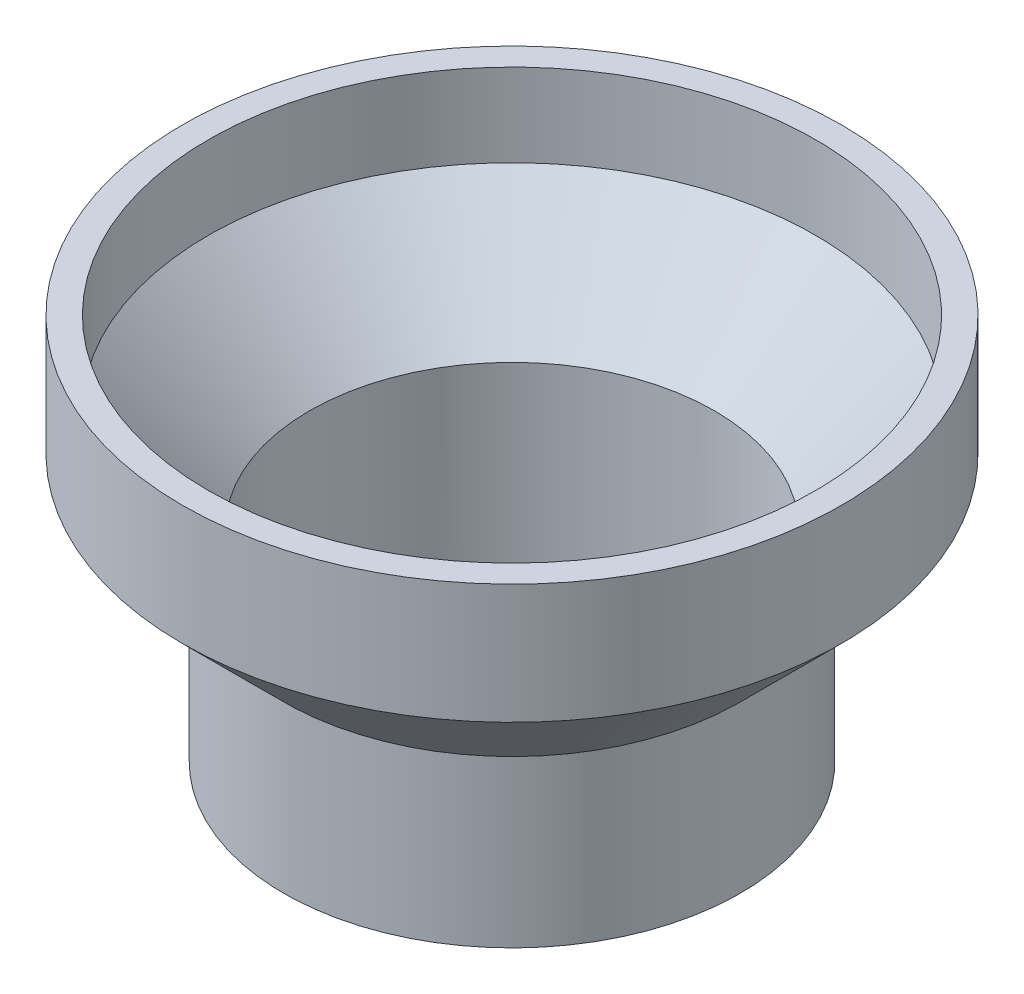
ISO-10303-21;
HEADER;
FILE_DESCRIPTION(('STEP AP214'),'2;1');
FILE_NAME('part.step','',(''),(''),'','','');
FILE_SCHEMA(('AUTOMOTIVE_DESIGN { 1 0 10303 214 1 1 1 1 }'));
ENDSEC;
DATA;
#1=APPLICATION_CONTEXT('core data for automotive mechanical design processes');
#2=APPLICATION_PROTOCOL_DEFINITION('international standard','automotive_design',2000,#1);
#3=PRODUCT_CONTEXT('',#1,'mechanical');
#4=PRODUCT('Part','Part','',(#3));
#5=PRODUCT_RELATED_PRODUCT_CATEGORY('part','',(#4));
#6=PRODUCT_DEFINITION_FORMATION('','',#4);
#7=PRODUCT_DEFINITION_CONTEXT('part definition',#1,'design');
#8=PRODUCT_DEFINITION('design','',#6,#7);
#9=PRODUCT_DEFINITION_SHAPE('','',#8);
#10=(LENGTH_UNIT() NAMED_UNIT(*) SI_UNIT(.MILLI.,.METRE.));
#11=(NAMED_UNIT(*) PLANE_ANGLE_UNIT() SI_UNIT($,.RADIAN.));
#12=(NAMED_UNIT(*) SI_UNIT($,.STERADIAN.) SOLID_ANGLE_UNIT());
#13=UNCERTAINTY_MEASURE_WITH_UNIT(LENGTH_MEASURE(1.E-05),#10,'distance_accuracy_value','');
#14=(GEOMETRIC_REPRESENTATION_CONTEXT(3) GLOBAL_UNCERTAINTY_ASSIGNED_CONTEXT((#13)) GLOBAL_UNIT_ASSIGNED_CONTEXT((#10,
#11,#12)) REPRESENTATION_CONTEXT('',''));
#15=CARTESIAN_POINT('',(0.,0.,0.));
#16=DIRECTION('',(0.,0.,1.));
#17=DIRECTION('',(1.,0.,0.));
#18=AXIS2_PLACEMENT_3D('',#15,#16,#17);
#19=CARTESIAN_POINT('',(0.,19.05,0.));
#20=DIRECTION('',(0.,-1.,0.));
#21=DIRECTION('',(0.,0.,-1.));
#22=AXIS2_PLACEMENT_3D('',#19,#20,#21);
#23=CYLINDRICAL_SURFACE('',#22,13.97);
#24=CARTESIAN_POINT('',(0.,13.9699999999999,0.));
#25=DIRECTION('',(0.,1.,0.));
#26=DIRECTION('',(0.,0.,1.));
#27=AXIS2_PLACEMENT_3D('',#24,#25,#26);
#28=CIRCLE('',#27,13.97);
#29=CARTESIAN_POINT('',(0.,13.9699999999999,-13.97));
#30=VERTEX_POINT('',#29);
#31=EDGE_CURVE('E45',#30,#30,#28,.T.);
#32=CARTESIAN_POINT('',(0.,0.,0.));
#33=DIRECTION('',(0.,1.,0.));
#34=DIRECTION('',(0.,0.,1.));
#35=AXIS2_PLACEMENT_3D('',#32,#33,#34);
#36=CIRCLE('',#35,13.97);
#37=CARTESIAN_POINT('',(0.,0.,-13.97));
#38=VERTEX_POINT('',#37);
#39=EDGE_CURVE('E65',#38,#38,#36,.T.);
#40=CARTESIAN_POINT('',(0.,13.9699999999999,-13.97));
#41=CARTESIAN_POINT('',(0.,13.8244791666665,-13.97));
#42=CARTESIAN_POINT('',(0.,13.6789583333332,-13.97));
#43=CARTESIAN_POINT('',(0.,13.3879166666665,-13.97));
#44=CARTESIAN_POINT('',(0.,13.2423958333332,-13.97));
#45=CARTESIAN_POINT('',(0.,12.9513541666665,-13.97));
#46=CARTESIAN_POINT('',(0.,12.8058333333332,-13.97));
#47=CARTESIAN_POINT('',(0.,12.5147916666665,-13.97));
#48=CARTESIAN_POINT('',(0.,12.3692708333332,-13.97));
#49=CARTESIAN_POINT('',(0.,12.0782291666666,-13.97));
#50=CARTESIAN_POINT('',(0.,11.9327083333332,-13.97));
#51=CARTESIAN_POINT('',(0.,11.6416666666666,-13.97));
#52=CARTESIAN_POINT('',(0.,11.4961458333332,-13.97));
#53=CARTESIAN_POINT('',(0.,11.2051041666666,-13.97));
#54=CARTESIAN_POINT('',(0.,11.0595833333332,-13.97));
#55=CARTESIAN_POINT('',(0.,10.7685416666666,-13.97));
#56=CARTESIAN_POINT('',(0.,10.6230208333332,-13.97));
#57=CARTESIAN_POINT('',(0.,10.3319791666666,-13.97));
#58=CARTESIAN_POINT('',(0.,10.1864583333332,-13.97));
#59=CARTESIAN_POINT('',(0.,9.89541666666657,-13.97));
#60=CARTESIAN_POINT('',(0.,9.74989583333324,-13.97));
#61=CARTESIAN_POINT('',(0.,9.45885416666658,-13.97));
#62=CARTESIAN_POINT('',(0.,9.31333333333325,-13.97));
#63=CARTESIAN_POINT('',(0.,9.02229166666658,-13.97));
#64=CARTESIAN_POINT('',(0.,8.87677083333325,-13.97));
#65=CARTESIAN_POINT('',(0.,8.58572916666659,-13.97));
#66=CARTESIAN_POINT('',(0.,8.44020833333325,-13.97));
#67=CARTESIAN_POINT('',(0.,8.14916666666659,-13.97));
#68=CARTESIAN_POINT('',(0.,8.00364583333326,-13.97));
#69=CARTESIAN_POINT('',(0.,7.71260416666659,-13.97));
#70=CARTESIAN_POINT('',(0.,7.56708333333326,-13.97));
#71=CARTESIAN_POINT('',(0.,7.2760416666666,-13.97));
#72=CARTESIAN_POINT('',(0.,7.13052083333327,-13.97));
#73=CARTESIAN_POINT('',(0.,6.8394791666666,-13.97));
#74=CARTESIAN_POINT('',(0.,6.69395833333327,-13.97));
#75=CARTESIAN_POINT('',(0.,6.4029166666666,-13.97));
#76=CARTESIAN_POINT('',(0.,6.25739583333327,-13.97));
#77=CARTESIAN_POINT('',(0.,5.96635416666661,-13.97));
#78=CARTESIAN_POINT('',(0.,5.82083333333328,-13.97));
#79=CARTESIAN_POINT('',(0.,5.52979166666661,-13.97));
#80=CARTESIAN_POINT('',(0.,5.38427083333328,-13.97));
#81=CARTESIAN_POINT('',(0.,5.09322916666662,-13.97));
#82=CARTESIAN_POINT('',(0.,4.94770833333329,-13.97));
#83=CARTESIAN_POINT('',(0.,4.65666666666662,-13.97));
#84=CARTESIAN_POINT('',(0.,4.51114583333329,-13.97));
#85=CARTESIAN_POINT('',(0.,4.22010416666663,-13.97));
#86=CARTESIAN_POINT('',(0.,4.07458333333329,-13.97));
#87=CARTESIAN_POINT('',(0.,3.78354166666663,-13.97));
#88=CARTESIAN_POINT('',(0.,3.6380208333333,-13.97));
#89=CARTESIAN_POINT('',(0.,3.34697916666664,-13.97));
#90=CARTESIAN_POINT('',(0.,3.2014583333333,-13.97));
#91=CARTESIAN_POINT('',(0.,2.91041666666664,-13.97));
#92=CARTESIAN_POINT('',(0.,2.76489583333331,-13.97));
#93=CARTESIAN_POINT('',(0.,2.47385416666664,-13.97));
#94=CARTESIAN_POINT('',(0.,2.32833333333331,-13.97));
#95=CARTESIAN_POINT('',(0.,2.03729166666665,-13.97));
#96=CARTESIAN_POINT('',(0.,1.89177083333332,-13.97));
#97=CARTESIAN_POINT('',(0.,1.60072916666665,-13.97));
#98=CARTESIAN_POINT('',(0.,1.45520833333332,-13.97));
#99=CARTESIAN_POINT('',(0.,1.16416666666666,-13.97));
#100=CARTESIAN_POINT('',(0.,1.01864583333332,-13.97));
#101=CARTESIAN_POINT('',(0.,0.727604166666659,-13.97));
#102=CARTESIAN_POINT('',(0.,0.582083333333327,-13.97));
#103=CARTESIAN_POINT('',(0.,0.291041666666663,-13.97));
#104=CARTESIAN_POINT('',(0.,0.145520833333331,-13.97));
#105=CARTESIAN_POINT('',(0.,0.,-13.97));
#106=B_SPLINE_CURVE_WITH_KNOTS('',3,(#40,#41,#42,#43,#44,#45,#46,#47,#48,#49,#50,#51,#52,#53,
#54,#55,#56,#57,#58,#59,#60,#61,#62,#63,#64,#65,#66,#67,#68,#69,#70,#71,#72,#73,#74,#75,#76,#77,
#78,#79,#80,#81,#82,#83,#84,#85,#86,#87,#88,#89,#90,#91,#92,#93,#94,#95,#96,#97,#98,#99,#100,
#101,#102,#103,#104,#105),.UNSPECIFIED.,.F.,.F.,(4,2,2,2,2,2,2,2,2,2,2,2,2,2,2,2,2,2,2,2,2,2,2,
2,2,2,2,2,2,2,2,2,4),(0.,0.436562499999998,0.873124999999992,1.30968749999999,1.74624999999998,
2.18281249999998,2.61937499999998,3.05593749999997,3.49249999999997,3.92906249999996,
4.36562499999996,4.80218749999996,5.23874999999995,5.67531249999995,6.11187499999994,
6.54843749999994,6.98499999999993,7.42156249999993,7.85812499999993,8.29468749999992,
8.73124999999992,9.16781249999991,9.60437499999991,10.0409374999999,10.4774999999999,
10.9140624999999,11.3506249999999,11.7871874999999,12.2237499999999,12.6603124999999,
13.0968749999999,13.5334374999999,13.9699999999999),.UNSPECIFIED.);
#107=EDGE_CURVE('BSEAM37',#30,#38,#106,.T.);
#108=ORIENTED_EDGE('',*,*,#31,.T.);
#109=ORIENTED_EDGE('',*,*,#39,.F.);
#110=ORIENTED_EDGE('',*,*,#107,.T.);
#111=ORIENTED_EDGE('',*,*,#107,.F.);
#112=EDGE_LOOP('',(#108,#110,#109,#111));
#113=FACE_BOUND('',#112,.T.);
#114=ADVANCED_FACE('F37',(#113),#23,.F.);
#115=CARTESIAN_POINT('',(0.,0.,0.));
#116=DIRECTION('',(0.,1.,0.));
#117=DIRECTION('',(0.,0.,1.));
#118=AXIS2_PLACEMENT_3D('',#115,#116,#117);
#119=PLANE('',#118);
#120=CARTESIAN_POINT('',(0.,0.,0.));
#121=DIRECTION('',(0.,1.,0.));
#122=DIRECTION('',(0.,0.,1.));
#123=AXIS2_PLACEMENT_3D('',#120,#121,#122);
#124=CIRCLE('',#123,15.748);
#125=CARTESIAN_POINT('',(0.,0.,-15.748));
#126=VERTEX_POINT('',#125);
#127=EDGE_CURVE('E61',#126,#126,#124,.T.);
#128=ORIENTED_EDGE('',*,*,#127,.F.);
#129=EDGE_LOOP('',(#128));
#130=FACE_BOUND('',#129,.T.);
#131=ORIENTED_EDGE('',*,*,#39,.T.);
#132=EDGE_LOOP('',(#131));
#133=FACE_BOUND('',#132,.T.);
#134=ADVANCED_FACE('F98',(#130,#133),#119,.F.);
#135=CARTESIAN_POINT('',(0.,19.05,0.));
#136=DIRECTION('',(0.,-1.,0.));
#137=DIRECTION('',(0.,0.,-1.));
#138=AXIS2_PLACEMENT_3D('',#135,#136,#137);
#139=CYLINDRICAL_SURFACE('',#138,15.748);
#140=CARTESIAN_POINT('',(0.,11.4299999999999,0.));
#141=DIRECTION('',(0.,1.,0.));
#142=DIRECTION('',(0.,0.,1.));
#143=AXIS2_PLACEMENT_3D('',#140,#141,#142);
#144=CIRCLE('',#143,15.748);
#145=CARTESIAN_POINT('',(0.,11.4299999999999,-15.748));
#146=VERTEX_POINT('',#145);
#147=EDGE_CURVE('E55',#146,#146,#144,.F.);
#148=CARTESIAN_POINT('',(0.,11.4299999999999,-15.748));
#149=CARTESIAN_POINT('',(0.,11.3109374999999,-15.748));
#150=CARTESIAN_POINT('',(0.,11.1918749999999,-15.748));
#151=CARTESIAN_POINT('',(0.,10.9537499999999,-15.748));
#152=CARTESIAN_POINT('',(0.,10.8346874999999,-15.748));
#153=CARTESIAN_POINT('',(0.,10.5965625,-15.748));
#154=CARTESIAN_POINT('',(0.,10.4775,-15.748));
#155=CARTESIAN_POINT('',(0.,10.239375,-15.748));
#156=CARTESIAN_POINT('',(0.,10.1203125,-15.748));
#157=CARTESIAN_POINT('',(0.,9.88218749999995,-15.748));
#158=CARTESIAN_POINT('',(0.,9.76312499999995,-15.748));
#159=CARTESIAN_POINT('',(0.,9.52499999999996,-15.748));
#160=CARTESIAN_POINT('',(0.,9.40593749999996,-15.748));
#161=CARTESIAN_POINT('',(0.,9.16781249999996,-15.748));
#162=CARTESIAN_POINT('',(0.,9.04874999999996,-15.748));
#163=CARTESIAN_POINT('',(0.,8.81062499999996,-15.748));
#164=CARTESIAN_POINT('',(0.,8.69156249999996,-15.748));
#165=CARTESIAN_POINT('',(0.,8.45343749999996,-15.748));
#166=CARTESIAN_POINT('',(0.,8.33437499999996,-15.748));
#167=CARTESIAN_POINT('',(0.,8.09624999999996,-15.748));
#168=CARTESIAN_POINT('',(0.,7.97718749999996,-15.748));
#169=CARTESIAN_POINT('',(0.,7.73906249999996,-15.748));
#170=CARTESIAN_POINT('',(0.,7.61999999999997,-15.748));
#171=CARTESIAN_POINT('',(0.,7.38187499999997,-15.748));
#172=CARTESIAN_POINT('',(0.,7.26281249999997,-15.748));
#173=CARTESIAN_POINT('',(0.,7.02468749999997,-15.748));
#174=CARTESIAN_POINT('',(0.,6.90562499999997,-15.748));
#175=CARTESIAN_POINT('',(0.,6.66749999999997,-15.748));
#176=CARTESIAN_POINT('',(0.,6.54843749999997,-15.748));
#177=CARTESIAN_POINT('',(0.,6.31031249999997,-15.748));
#178=CARTESIAN_POINT('',(0.,6.19124999999997,-15.748));
#179=CARTESIAN_POINT('',(0.,5.95312499999997,-15.748));
#180=CARTESIAN_POINT('',(0.,5.83406249999997,-15.748));
#181=CARTESIAN_POINT('',(0.,5.59593749999997,-15.748));
#182=CARTESIAN_POINT('',(0.,5.47687499999997,-15.748));
#183=CARTESIAN_POINT('',(0.,5.23874999999997,-15.748));
#184=CARTESIAN_POINT('',(0.,5.11968749999997,-15.748));
#185=CARTESIAN_POINT('',(0.,4.88156249999998,-15.748));
#186=CARTESIAN_POINT('',(0.,4.76249999999998,-15.748));
#187=CARTESIAN_POINT('',(0.,4.52437499999998,-15.748));
#188=CARTESIAN_POINT('',(0.,4.40531249999998,-15.748));
#189=CARTESIAN_POINT('',(0.,4.16718749999998,-15.748));
#190=CARTESIAN_POINT('',(0.,4.04812499999998,-15.748));
#191=CARTESIAN_POINT('',(0.,3.80999999999998,-15.748));
#192=CARTESIAN_POINT('',(0.,3.69093749999998,-15.748));
#193=CARTESIAN_POINT('',(0.,3.45281249999998,-15.748));
#194=CARTESIAN_POINT('',(0.,3.33374999999999,-15.748));
#195=CARTESIAN_POINT('',(0.,3.09562499999999,-15.748));
#196=CARTESIAN_POINT('',(0.,2.97656249999999,-15.748));
#197=CARTESIAN_POINT('',(0.,2.73843749999999,-15.748));
#198=CARTESIAN_POINT('',(0.,2.61937499999999,-15.748));
#199=CARTESIAN_POINT('',(0.,2.38124999999999,-15.748));
#200=CARTESIAN_POINT('',(0.,2.26218749999999,-15.748));
#201=CARTESIAN_POINT('',(0.,2.02406249999999,-15.748));
#202=CARTESIAN_POINT('',(0.,1.90499999999999,-15.748));
#203=CARTESIAN_POINT('',(0.,1.66687499999999,-15.748));
#204=CARTESIAN_POINT('',(0.,1.54781249999999,-15.748));
#205=CARTESIAN_POINT('',(0.,1.30968749999999,-15.748));
#206=CARTESIAN_POINT('',(0.,1.19062499999999,-15.748));
#207=CARTESIAN_POINT('',(0.,0.952499999999995,-15.748));
#208=CARTESIAN_POINT('',(0.,0.833437499999996,-15.748));
#209=CARTESIAN_POINT('',(0.,0.595312499999997,-15.748));
#210=CARTESIAN_POINT('',(0.,0.476249999999998,-15.748));
#211=CARTESIAN_POINT('',(0.,0.238124999999999,-15.748));
#212=CARTESIAN_POINT('',(0.,0.119062499999999,-15.748));
#213=CARTESIAN_POINT('',(0.,0.,-15.748));
#214=B_SPLINE_CURVE_WITH_KNOTS('',3,(#148,#149,#150,#151,#152,#153,#154,#155,#156,#157,#158,
#159,#160,#161,#162,#163,#164,#165,#166,#167,#168,#169,#170,#171,#172,#173,#174,#175,#176,#177,
#178,#179,#180,#181,#182,#183,#184,#185,#186,#187,#188,#189,#190,#191,#192,#193,#194,#195,#196,
#197,#198,#199,#200,#201,#202,#203,#204,#205,#206,#207,#208,#209,#210,#211,#212,#213),
.UNSPECIFIED.,.F.,.F.,(4,2,2,2,2,2,2,2,2,2,2,2,2,2,2,2,2,2,2,2,2,2,2,2,2,2,2,2,2,2,2,2,4),(0.,
0.357187499999998,0.714374999999996,1.0715625,1.42874999999999,1.78593749999999,
2.14312499999999,2.50031249999999,2.85749999999999,3.21468749999999,3.57187499999998,
3.92906249999998,4.28624999999998,4.64343749999998,5.00062499999998,5.35781249999998,
5.71499999999997,6.07218749999997,6.42937499999997,6.78656249999997,7.14374999999997,
7.50093749999997,7.85812499999996,8.21531249999996,8.57249999999996,8.92968749999996,
9.28687499999996,9.64406249999995,10.00125,10.3584375,10.715625,11.0728124999999,
11.4299999999999),.UNSPECIFIED.);
#215=EDGE_CURVE('BSEAM84',#146,#126,#214,.T.);
#216=ORIENTED_EDGE('',*,*,#147,.T.);
#217=ORIENTED_EDGE('',*,*,#127,.T.);
#218=ORIENTED_EDGE('',*,*,#215,.T.);
#219=ORIENTED_EDGE('',*,*,#215,.F.);
#220=EDGE_LOOP('',(#216,#218,#217,#219));
#221=FACE_BOUND('',#220,.T.);
#222=ADVANCED_FACE('F84',(#221),#139,.T.);
#223=CARTESIAN_POINT('',(0.,26.67,0.));
#224=DIRECTION('',(0.,1.,0.));
#225=DIRECTION('',(0.,0.,1.));
#226=AXIS2_PLACEMENT_3D('',#223,#224,#225);
#227=PLANE('',#226);
#228=CARTESIAN_POINT('',(0.,26.67,0.));
#229=DIRECTION('',(0.,1.,0.));
#230=DIRECTION('',(0.,0.,1.));
#231=AXIS2_PLACEMENT_3D('',#228,#229,#230);
#232=CIRCLE('',#231,20.955);
#233=CARTESIAN_POINT('',(0.,26.67,20.955));
#234=VERTEX_POINT('',#233);
#235=EDGE_CURVE('E73',#234,#234,#232,.T.);
#236=ORIENTED_EDGE('',*,*,#235,.F.);
#237=EDGE_LOOP('',(#236));
#238=FACE_BOUND('',#237,.T.);
#239=CARTESIAN_POINT('',(0.,26.67,0.));
#240=DIRECTION('',(0.,1.,0.));
#241=DIRECTION('',(0.,0.,1.));
#242=AXIS2_PLACEMENT_3D('',#239,#240,#241);
#243=CIRCLE('',#242,22.733);
#244=CARTESIAN_POINT('',(0.,26.67,-22.733));
#245=VERTEX_POINT('',#244);
#246=EDGE_CURVE('E69',#245,#245,#243,.T.);
#247=ORIENTED_EDGE('',*,*,#246,.T.);
#248=EDGE_LOOP('',(#247));
#249=FACE_BOUND('',#248,.T.);
#250=ADVANCED_FACE('F80',(#238,#249),#227,.T.);
#251=CARTESIAN_POINT('',(0.,26.67,0.));
#252=DIRECTION('',(0.,-1.,0.));
#253=DIRECTION('',(0.,0.,-1.));
#254=AXIS2_PLACEMENT_3D('',#251,#252,#253);
#255=CYLINDRICAL_SURFACE('',#254,22.733);
#256=CARTESIAN_POINT('',(0.,18.4149999999999,0.));
#257=DIRECTION('',(0.,1.,0.));
#258=DIRECTION('',(0.,0.,1.));
#259=AXIS2_PLACEMENT_3D('',#256,#257,#258);
#260=CIRCLE('',#259,22.733);
#261=CARTESIAN_POINT('',(0.,18.4149999999999,-22.733));
#262=VERTEX_POINT('',#261);
#263=EDGE_CURVE('E50',#262,#262,#260,.T.);
#264=CARTESIAN_POINT('',(0.,18.4149999999999,-22.733));
#265=CARTESIAN_POINT('',(0.,18.5009895833332,-22.733));
#266=CARTESIAN_POINT('',(0.,18.5869791666666,-22.733));
#267=CARTESIAN_POINT('',(0.,18.7589583333332,-22.733));
#268=CARTESIAN_POINT('',(0.,18.8449479166666,-22.733));
#269=CARTESIAN_POINT('',(0.,19.0169270833332,-22.733));
#270=CARTESIAN_POINT('',(0.,19.1029166666666,-22.733));
#271=CARTESIAN_POINT('',(0.,19.2748958333332,-22.733));
#272=CARTESIAN_POINT('',(0.,19.3608854166666,-22.733));
#273=CARTESIAN_POINT('',(0.,19.5328645833332,-22.733));
#274=CARTESIAN_POINT('',(0.,19.6188541666666,-22.733));
#275=CARTESIAN_POINT('',(0.,19.7908333333332,-22.733));
#276=CARTESIAN_POINT('',(0.,19.8768229166666,-22.733));
#277=CARTESIAN_POINT('',(0.,20.0488020833332,-22.733));
#278=CARTESIAN_POINT('',(0.,20.1347916666666,-22.733));
#279=CARTESIAN_POINT('',(0.,20.3067708333332,-22.733));
#280=CARTESIAN_POINT('',(0.,20.3927604166666,-22.733));
#281=CARTESIAN_POINT('',(0.,20.5647395833332,-22.733));
#282=CARTESIAN_POINT('',(0.,20.6507291666666,-22.733));
#283=CARTESIAN_POINT('',(0.,20.8227083333332,-22.733));
#284=CARTESIAN_POINT('',(0.,20.9086979166666,-22.733));
#285=CARTESIAN_POINT('',(0.,21.0806770833333,-22.733));
#286=CARTESIAN_POINT('',(0.,21.1666666666666,-22.733));
#287=CARTESIAN_POINT('',(0.,21.3386458333333,-22.733));
#288=CARTESIAN_POINT('',(0.,21.4246354166666,-22.733));
#289=CARTESIAN_POINT('',(0.,21.5966145833333,-22.733));
#290=CARTESIAN_POINT('',(0.,21.6826041666666,-22.733));
#291=CARTESIAN_POINT('',(0.,21.8545833333333,-22.733));
#292=CARTESIAN_POINT('',(0.,21.9405729166666,-22.733));
#293=CARTESIAN_POINT('',(0.,22.1125520833333,-22.733));
#294=CARTESIAN_POINT('',(0.,22.1985416666666,-22.733));
#295=CARTESIAN_POINT('',(0.,22.3705208333333,-22.733));
#296=CARTESIAN_POINT('',(0.,22.4565104166666,-22.733));
#297=CARTESIAN_POINT('',(0.,22.6284895833333,-22.733));
#298=CARTESIAN_POINT('',(0.,22.7144791666666,-22.733));
#299=CARTESIAN_POINT('',(0.,22.8864583333333,-22.733));
#300=CARTESIAN_POINT('',(0.,22.9724479166666,-22.733));
#301=CARTESIAN_POINT('',(0.,23.1444270833333,-22.733));
#302=CARTESIAN_POINT('',(0.,23.2304166666666,-22.733));
#303=CARTESIAN_POINT('',(0.,23.4023958333333,-22.733));
#304=CARTESIAN_POINT('',(0.,23.4883854166666,-22.733));
#305=CARTESIAN_POINT('',(0.,23.6603645833333,-22.733));
#306=CARTESIAN_POINT('',(0.,23.7463541666666,-22.733));
#307=CARTESIAN_POINT('',(0.,23.9183333333333,-22.733));
#308=CARTESIAN_POINT('',(0.,24.0043229166666,-22.733));
#309=CARTESIAN_POINT('',(0.,24.1763020833333,-22.733));
#310=CARTESIAN_POINT('',(0.,24.2622916666666,-22.733));
#311=CARTESIAN_POINT('',(0.,24.4342708333333,-22.733));
#312=CARTESIAN_POINT('',(0.,24.5202604166666,-22.733));
#313=CARTESIAN_POINT('',(0.,24.6922395833333,-22.733));
#314=CARTESIAN_POINT('',(0.,24.7782291666666,-22.733));
#315=CARTESIAN_POINT('',(0.,24.9502083333333,-22.733));
#316=CARTESIAN_POINT('',(0.,25.0361979166666,-22.733));
#317=CARTESIAN_POINT('',(0.,25.2081770833333,-22.733));
#318=CARTESIAN_POINT('',(0.,25.2941666666666,-22.733));
#319=CARTESIAN_POINT('',(0.,25.4661458333333,-22.733));
#320=CARTESIAN_POINT('',(0.,25.5521354166666,-22.733));
#321=CARTESIAN_POINT('',(0.,25.7241145833333,-22.733));
#322=CARTESIAN_POINT('',(0.,25.8101041666667,-22.733));
#323=CARTESIAN_POINT('',(0.,25.9820833333333,-22.733));
#324=CARTESIAN_POINT('',(0.,26.0680729166667,-22.733));
#325=CARTESIAN_POINT('',(0.,26.2400520833333,-22.733));
#326=CARTESIAN_POINT('',(0.,26.3260416666667,-22.733));
#327=CARTESIAN_POINT('',(0.,26.4980208333333,-22.733));
#328=CARTESIAN_POINT('',(0.,26.5840104166667,-22.733));
#329=CARTESIAN_POINT('',(0.,26.67,-22.733));
#330=B_SPLINE_CURVE_WITH_KNOTS('',3,(#264,#265,#266,#267,#268,#269,#270,#271,#272,#273,#274,
#275,#276,#277,#278,#279,#280,#281,#282,#283,#284,#285,#286,#287,#288,#289,#290,#291,#292,#293,
#294,#295,#296,#297,#298,#299,#300,#301,#302,#303,#304,#305,#306,#307,#308,#309,#310,#311,#312,
#313,#314,#315,#316,#317,#318,#319,#320,#321,#322,#323,#324,#325,#326,#327,#328,#329),
.UNSPECIFIED.,.F.,.F.,(4,2,2,2,2,2,2,2,2,2,2,2,2,2,2,2,2,2,2,2,2,2,2,2,2,2,2,2,2,2,2,2,4),(0.,
0.257968750000004,0.515937500000004,0.773906250000008,1.03187500000001,1.28984375000002,
1.54781250000002,1.80578125000002,2.06375000000003,2.32171875000003,2.57968750000003,
2.83765625000004,3.09562500000004,3.35359375000005,3.61156250000005,3.86953125000005,
4.12750000000005,4.38546875000006,4.64343750000006,4.90140625000007,5.15937500000007,
5.41734375000007,5.67531250000008,5.93328125000008,6.19125000000009,6.44921875000009,
6.70718750000009,6.9651562500001,7.2231250000001,7.48109375000011,7.73906250000011,
7.99703125000011,8.25500000000012),.UNSPECIFIED.);
#331=EDGE_CURVE('BSEAM83',#262,#245,#330,.T.);
#332=ORIENTED_EDGE('',*,*,#263,.T.);
#333=ORIENTED_EDGE('',*,*,#246,.F.);
#334=ORIENTED_EDGE('',*,*,#331,.T.);
#335=ORIENTED_EDGE('',*,*,#331,.F.);
#336=EDGE_LOOP('',(#332,#334,#333,#335));
#337=FACE_BOUND('',#336,.T.);
#338=ADVANCED_FACE('F83',(#337),#255,.T.);
#339=CARTESIAN_POINT('',(0.,21.59,0.));
#340=DIRECTION('',(0.,1.,0.));
#341=DIRECTION('',(0.,0.,1.));
#342=AXIS2_PLACEMENT_3D('',#339,#340,#341);
#343=CYLINDRICAL_SURFACE('',#342,20.955);
#344=CARTESIAN_POINT('',(0.,20.9549999999999,0.));
#345=DIRECTION('',(0.,1.,0.));
#346=DIRECTION('',(0.,0.,1.));
#347=AXIS2_PLACEMENT_3D('',#344,#345,#346);
#348=CIRCLE('',#347,20.955);
#349=CARTESIAN_POINT('',(0.,20.9549999999999,20.955));
#350=VERTEX_POINT('',#349);
#351=EDGE_CURVE('E10',#350,#350,#348,.F.);
#352=ORIENTED_EDGE('',*,*,#351,.T.);
#353=EDGE_LOOP('',(#352));
#354=FACE_BOUND('',#353,.T.);
#355=ORIENTED_EDGE('',*,*,#235,.T.);
#356=EDGE_LOOP('',(#355));
#357=FACE_BOUND('',#356,.T.);
#358=ADVANCED_FACE('F78',(#354,#357),#343,.F.);
#359=CARTESIAN_POINT('',(0.,19.05,0.));
#360=DIRECTION('',(0.,1.,0.));
#361=DIRECTION('',(0.,0.,1.));
#362=AXIS2_PLACEMENT_3D('',#359,#360,#361);
#363=CONICAL_SURFACE('',#362,23.3680000000001,0.785398163397454);
#364=ORIENTED_EDGE('',*,*,#147,.F.);
#365=EDGE_LOOP('',(#364));
#366=FACE_BOUND('',#365,.T.);
#367=ORIENTED_EDGE('',*,*,#263,.F.);
#368=EDGE_LOOP('',(#367));
#369=FACE_BOUND('',#368,.T.);
#370=ADVANCED_FACE('F94',(#366,#369),#363,.T.);
#371=CARTESIAN_POINT('',(0.,13.9699999999999,0.));
#372=DIRECTION('',(0.,1.,0.));
#373=DIRECTION('',(0.,0.,1.));
#374=AXIS2_PLACEMENT_3D('',#371,#372,#373);
#375=CONICAL_SURFACE('',#374,13.97,0.785398163397443);
#376=ORIENTED_EDGE('',*,*,#351,.F.);
#377=EDGE_LOOP('',(#376));
#378=FACE_BOUND('',#377,.T.);
#379=ORIENTED_EDGE('',*,*,#31,.F.);
#380=EDGE_LOOP('',(#379));
#381=FACE_BOUND('',#380,.T.);
#382=ADVANCED_FACE('F39',(#378,#381),#375,.F.);
#383=CLOSED_SHELL('',(#114,#134,#222,#250,#338,#358,#370,#382));
#384=MANIFOLD_SOLID_BREP('B2',#383);
#385=ADVANCED_BREP_SHAPE_REPRESENTATION('',(#18,#384),#14);
#386=SHAPE_DEFINITION_REPRESENTATION(#9,#385);
ENDSEC;
END-ISO-10303-21;
